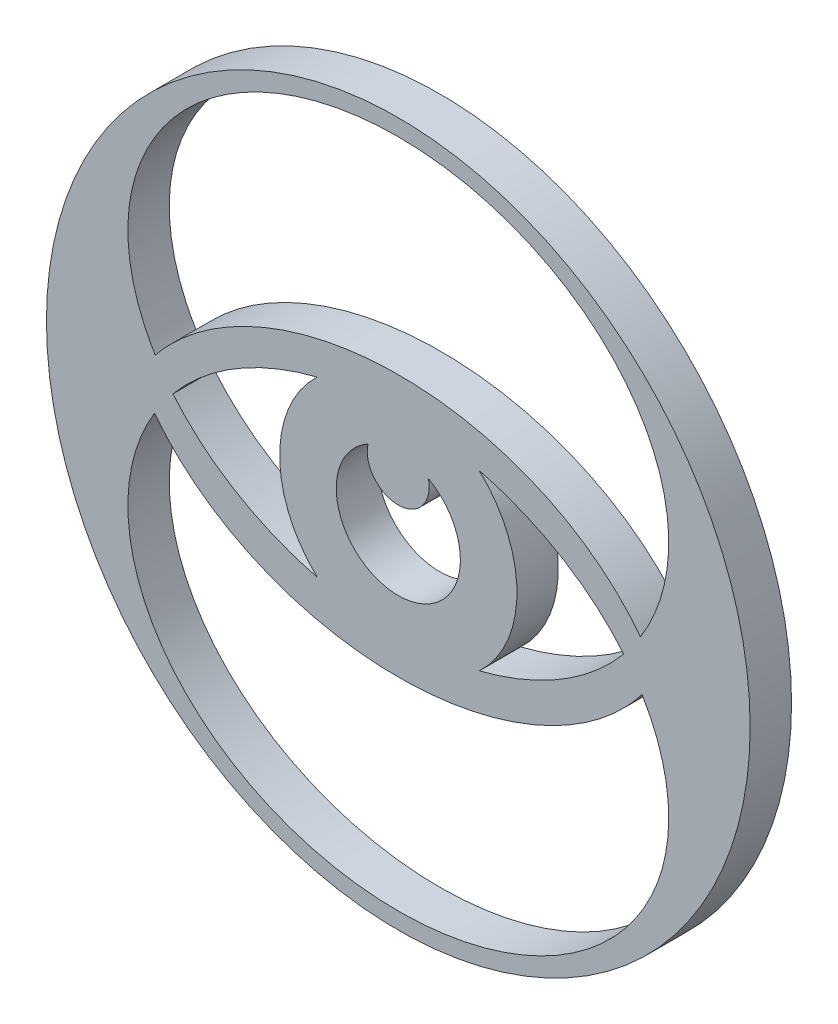
ISO-10303-21;
HEADER;
FILE_DESCRIPTION(('STEP AP214'),'2;1');
FILE_NAME('part.step','',(''),(''),'','','');
FILE_SCHEMA(('AUTOMOTIVE_DESIGN { 1 0 10303 214 1 1 1 1 }'));
ENDSEC;
DATA;
#1=APPLICATION_CONTEXT('core data for automotive mechanical design processes');
#2=APPLICATION_PROTOCOL_DEFINITION('international standard','automotive_design',2000,#1);
#3=PRODUCT_CONTEXT('',#1,'mechanical');
#4=PRODUCT('Part','Part','',(#3));
#5=PRODUCT_RELATED_PRODUCT_CATEGORY('part','',(#4));
#6=PRODUCT_DEFINITION_FORMATION('','',#4);
#7=PRODUCT_DEFINITION_CONTEXT('part definition',#1,'design');
#8=PRODUCT_DEFINITION('design','',#6,#7);
#9=PRODUCT_DEFINITION_SHAPE('','',#8);
#10=(LENGTH_UNIT() NAMED_UNIT(*) SI_UNIT(.MILLI.,.METRE.));
#11=(NAMED_UNIT(*) PLANE_ANGLE_UNIT() SI_UNIT($,.RADIAN.));
#12=(NAMED_UNIT(*) SI_UNIT($,.STERADIAN.) SOLID_ANGLE_UNIT());
#13=UNCERTAINTY_MEASURE_WITH_UNIT(LENGTH_MEASURE(1.E-05),#10,'distance_accuracy_value','');
#14=(GEOMETRIC_REPRESENTATION_CONTEXT(3) GLOBAL_UNCERTAINTY_ASSIGNED_CONTEXT((#13)) GLOBAL_UNIT_ASSIGNED_CONTEXT((#10,
#11,#12)) REPRESENTATION_CONTEXT('',''));
#15=CARTESIAN_POINT('',(0.,0.,0.));
#16=DIRECTION('',(0.,0.,1.));
#17=DIRECTION('',(1.,0.,0.));
#18=AXIS2_PLACEMENT_3D('',#15,#16,#17);
#19=CARTESIAN_POINT('',(0.,0.,30.));
#20=DIRECTION('',(0.,0.,-1.));
#21=DIRECTION('',(-1.,0.,0.));
#22=AXIS2_PLACEMENT_3D('',#19,#20,#21);
#23=CYLINDRICAL_SURFACE('',#22,45.);
#24=CARTESIAN_POINT('',(0.,0.,0.));
#25=DIRECTION('',(0.,0.,1.));
#26=DIRECTION('',(1.,0.,0.));
#27=AXIS2_PLACEMENT_3D('',#24,#25,#26);
#28=CIRCLE('',#27,45.);
#29=CARTESIAN_POINT('',(-21.946440501405,39.2855412247087,0.));
#30=VERTEX_POINT('',#29);
#31=CARTESIAN_POINT('',(21.7692025819729,39.3840299987828,0.));
#32=VERTEX_POINT('',#31);
#33=EDGE_CURVE('E172',#30,#32,#28,.T.);
#34=ORIENTED_EDGE('',*,*,#33,.F.);
#35=DIRECTION('',(0.,0.,-1.));
#36=VECTOR('',#35,1.);
#37=CARTESIAN_POINT('',(-21.946440501405,39.2855412247087,30.));
#38=LINE('',#37,#36);
#39=CARTESIAN_POINT('',(-21.946440501405,39.2855412247087,30.));
#40=VERTEX_POINT('',#39);
#41=EDGE_CURVE('E11',#40,#30,#38,.T.);
#42=ORIENTED_EDGE('',*,*,#41,.F.);
#43=CARTESIAN_POINT('',(0.,0.,30.));
#44=DIRECTION('',(0.,0.,1.));
#45=DIRECTION('',(1.,0.,0.));
#46=AXIS2_PLACEMENT_3D('',#43,#44,#45);
#47=CIRCLE('',#46,45.);
#48=CARTESIAN_POINT('',(21.7692025819729,39.3840299987828,30.));
#49=VERTEX_POINT('',#48);
#50=EDGE_CURVE('E235',#40,#49,#47,.T.);
#51=ORIENTED_EDGE('',*,*,#50,.T.);
#52=DIRECTION('',(0.,0.,-1.));
#53=VECTOR('',#52,1.);
#54=CARTESIAN_POINT('',(21.7692025819729,39.3840299987828,30.));
#55=LINE('',#54,#53);
#56=EDGE_CURVE('E47',#49,#32,#55,.T.);
#57=ORIENTED_EDGE('',*,*,#56,.T.);
#58=EDGE_LOOP('',(#34,#42,#51,#57));
#59=FACE_BOUND('',#58,.T.);
#60=ADVANCED_FACE('F37',(#59),#23,.F.);
#61=CARTESIAN_POINT('',(0.,-86.5,30.));
#62=DIRECTION('',(0.,0.,1.));
#63=DIRECTION('',(1.,0.,0.));
#64=AXIS2_PLACEMENT_3D('',#61,#62,#63);
#65=ELLIPSE('',#64,196.,156.5);
#66=DIRECTION('',(0.,0.,-1.));
#67=VECTOR('',#66,1.);
#68=SURFACE_OF_LINEAR_EXTRUSION('',#65,#67);
#69=CARTESIAN_POINT('',(0.,-86.5,0.));
#70=DIRECTION('',(0.,0.,1.));
#71=DIRECTION('',(1.,0.,0.));
#72=AXIS2_PLACEMENT_3D('',#69,#70,#71);
#73=ELLIPSE('',#72,196.,156.5);
#74=CARTESIAN_POINT('',(163.340502110404,0.,0.));
#75=VERTEX_POINT('',#74);
#76=CARTESIAN_POINT('',(58.7510553616709,62.8037697426945,0.));
#77=VERTEX_POINT('',#76);
#78=EDGE_CURVE('E209',#75,#77,#73,.T.);
#79=ORIENTED_EDGE('',*,*,#78,.F.);
#80=DIRECTION('',(0.,0.,-1.));
#81=VECTOR('',#80,1.);
#82=CARTESIAN_POINT('',(163.340502110404,0.,30.));
#83=LINE('',#82,#81);
#84=CARTESIAN_POINT('',(163.340502110404,0.,30.));
#85=VERTEX_POINT('',#84);
#86=EDGE_CURVE('E158',#85,#75,#83,.T.);
#87=ORIENTED_EDGE('',*,*,#86,.F.);
#88=CARTESIAN_POINT('',(58.7510553616709,62.8037697426945,30.));
#89=VERTEX_POINT('',#88);
#90=EDGE_CURVE('E140',#85,#89,#65,.T.);
#91=ORIENTED_EDGE('',*,*,#90,.T.);
#92=DIRECTION('',(0.,0.,-1.));
#93=VECTOR('',#92,1.);
#94=CARTESIAN_POINT('',(58.7510553616709,62.8037697426945,30.));
#95=LINE('',#94,#93);
#96=EDGE_CURVE('E147',#89,#77,#95,.T.);
#97=ORIENTED_EDGE('',*,*,#96,.T.);
#98=EDGE_LOOP('',(#79,#87,#91,#97));
#99=FACE_BOUND('',#98,.T.);
#100=ADVANCED_FACE('F157',(#99),#68,.T.);
#101=CARTESIAN_POINT('',(0.,86.5,30.));
#102=DIRECTION('',(0.,0.,1.));
#103=DIRECTION('',(-1.,0.,0.));
#104=AXIS2_PLACEMENT_3D('',#101,#102,#103);
#105=ELLIPSE('',#104,196.,156.5);
#106=DIRECTION('',(0.,0.,-1.));
#107=VECTOR('',#106,1.);
#108=SURFACE_OF_LINEAR_EXTRUSION('',#105,#107);
#109=CARTESIAN_POINT('',(0.,86.5,0.));
#110=DIRECTION('',(0.,0.,1.));
#111=DIRECTION('',(-1.,0.,0.));
#112=AXIS2_PLACEMENT_3D('',#109,#110,#111);
#113=ELLIPSE('',#112,196.,156.5);
#114=CARTESIAN_POINT('',(58.7510553616709,-62.8037697426945,0.));
#115=VERTEX_POINT('',#114);
#116=EDGE_CURVE('E211',#115,#75,#113,.T.);
#117=ORIENTED_EDGE('',*,*,#116,.F.);
#118=DIRECTION('',(0.,0.,-1.));
#119=VECTOR('',#118,1.);
#120=CARTESIAN_POINT('',(58.7510553616709,-62.8037697426945,30.));
#121=LINE('',#120,#119);
#122=CARTESIAN_POINT('',(58.7510553616709,-62.8037697426945,30.));
#123=VERTEX_POINT('',#122);
#124=EDGE_CURVE('E154',#123,#115,#121,.T.);
#125=ORIENTED_EDGE('',*,*,#124,.F.);
#126=EDGE_CURVE('E142',#123,#85,#105,.T.);
#127=ORIENTED_EDGE('',*,*,#126,.T.);
#128=ORIENTED_EDGE('',*,*,#86,.T.);
#129=EDGE_LOOP('',(#117,#125,#127,#128));
#130=FACE_BOUND('',#129,.T.);
#131=ADVANCED_FACE('F255',(#130),#108,.T.);
#132=CARTESIAN_POINT('',(0.,-86.5,30.));
#133=DIRECTION('',(0.,0.,1.));
#134=DIRECTION('',(1.,0.,0.));
#135=AXIS2_PLACEMENT_3D('',#132,#133,#134);
#136=ELLIPSE('',#135,196.,156.5);
#137=DIRECTION('',(0.,0.,-1.));
#138=VECTOR('',#137,1.);
#139=SURFACE_OF_LINEAR_EXTRUSION('',#136,#138);
#140=CARTESIAN_POINT('',(0.,-86.5,0.));
#141=DIRECTION('',(0.,0.,1.));
#142=DIRECTION('',(1.,0.,0.));
#143=AXIS2_PLACEMENT_3D('',#140,#141,#142);
#144=ELLIPSE('',#143,196.,156.5);
#145=CARTESIAN_POINT('',(-176.723140987711,-18.8185608645506,0.));
#146=VERTEX_POINT('',#145);
#147=CARTESIAN_POINT('',(176.655344592701,-18.7058146197285,0.));
#148=VERTEX_POINT('',#147);
#149=EDGE_CURVE('E217',#146,#148,#144,.T.);
#150=ORIENTED_EDGE('',*,*,#149,.F.);
#151=DIRECTION('',(0.,0.,-1.));
#152=VECTOR('',#151,1.);
#153=CARTESIAN_POINT('',(-176.723140987711,-18.8185608645506,30.));
#154=LINE('',#153,#152);
#155=CARTESIAN_POINT('',(-176.723140987711,-18.8185608645506,30.));
#156=VERTEX_POINT('',#155);
#157=EDGE_CURVE('E155',#156,#146,#154,.T.);
#158=ORIENTED_EDGE('',*,*,#157,.F.);
#159=CARTESIAN_POINT('',(176.655344592701,-18.7058146197285,30.));
#160=VERTEX_POINT('',#159);
#161=EDGE_CURVE('E164',#156,#160,#136,.T.);
#162=ORIENTED_EDGE('',*,*,#161,.T.);
#163=DIRECTION('',(0.,0.,-1.));
#164=VECTOR('',#163,1.);
#165=CARTESIAN_POINT('',(176.655344592701,-18.7058146197285,30.));
#166=LINE('',#165,#164);
#167=EDGE_CURVE('E182',#160,#148,#166,.T.);
#168=ORIENTED_EDGE('',*,*,#167,.T.);
#169=EDGE_LOOP('',(#150,#158,#162,#168));
#170=FACE_BOUND('',#169,.T.);
#171=ADVANCED_FACE('F251',(#170),#139,.T.);
#172=CARTESIAN_POINT('',(0.,86.5,30.));
#173=DIRECTION('',(0.,0.,1.));
#174=DIRECTION('',(-1.,0.,0.));
#175=AXIS2_PLACEMENT_3D('',#172,#173,#174);
#176=ELLIPSE('',#175,196.,156.5);
#177=DIRECTION('',(0.,0.,-1.));
#178=VECTOR('',#177,1.);
#179=SURFACE_OF_LINEAR_EXTRUSION('',#176,#178);
#180=CARTESIAN_POINT('',(0.,86.5,0.));
#181=DIRECTION('',(0.,0.,1.));
#182=DIRECTION('',(-1.,0.,0.));
#183=AXIS2_PLACEMENT_3D('',#180,#181,#182);
#184=ELLIPSE('',#183,196.,156.5);
#185=CARTESIAN_POINT('',(175.499994084895,16.8189527249847,0.));
#186=VERTEX_POINT('',#185);
#187=CARTESIAN_POINT('',(-176.156401014823,17.8830771517218,0.));
#188=VERTEX_POINT('',#187);
#189=EDGE_CURVE('E297',#186,#188,#184,.T.);
#190=ORIENTED_EDGE('',*,*,#189,.F.);
#191=DIRECTION('',(0.,0.,-1.));
#192=VECTOR('',#191,1.);
#193=CARTESIAN_POINT('',(175.499994084895,16.8189527249847,30.));
#194=LINE('',#193,#192);
#195=CARTESIAN_POINT('',(175.499994084895,16.8189527249847,30.));
#196=VERTEX_POINT('',#195);
#197=EDGE_CURVE('E184',#196,#186,#194,.T.);
#198=ORIENTED_EDGE('',*,*,#197,.F.);
#199=CARTESIAN_POINT('',(-176.156401014823,17.8830771517218,30.));
#200=VERTEX_POINT('',#199);
#201=EDGE_CURVE('E263',#196,#200,#176,.T.);
#202=ORIENTED_EDGE('',*,*,#201,.T.);
#203=DIRECTION('',(0.,0.,-1.));
#204=VECTOR('',#203,1.);
#205=CARTESIAN_POINT('',(-176.156401014823,17.8830771517218,30.));
#206=LINE('',#205,#204);
#207=EDGE_CURVE('E186',#200,#188,#206,.T.);
#208=ORIENTED_EDGE('',*,*,#207,.T.);
#209=EDGE_LOOP('',(#190,#198,#202,#208));
#210=FACE_BOUND('',#209,.T.);
#211=ADVANCED_FACE('F254',(#210),#179,.T.);
#212=CARTESIAN_POINT('',(-58.7510553616663,62.8037697426895,0.));
#213=VERTEX_POINT('',#212);
#214=CARTESIAN_POINT('',(-163.340502110404,0.,0.));
#215=VERTEX_POINT('',#214);
#216=EDGE_CURVE('E204',#213,#215,#73,.T.);
#217=ORIENTED_EDGE('',*,*,#216,.F.);
#218=DIRECTION('',(0.,0.,-1.));
#219=VECTOR('',#218,1.);
#220=CARTESIAN_POINT('',(-58.7510553616663,62.8037697426895,30.));
#221=LINE('',#220,#219);
#222=CARTESIAN_POINT('',(-58.7510553616663,62.8037697426895,30.));
#223=VERTEX_POINT('',#222);
#224=EDGE_CURVE('E41',#223,#213,#221,.T.);
#225=ORIENTED_EDGE('',*,*,#224,.F.);
#226=CARTESIAN_POINT('',(-163.340502110404,0.,30.));
#227=VERTEX_POINT('',#226);
#228=EDGE_CURVE('E161',#223,#227,#65,.T.);
#229=ORIENTED_EDGE('',*,*,#228,.T.);
#230=DIRECTION('',(0.,0.,-1.));
#231=VECTOR('',#230,1.);
#232=CARTESIAN_POINT('',(-163.340502110404,0.,30.));
#233=LINE('',#232,#231);
#234=EDGE_CURVE('E189',#227,#215,#233,.T.);
#235=ORIENTED_EDGE('',*,*,#234,.T.);
#236=EDGE_LOOP('',(#217,#225,#229,#235));
#237=FACE_BOUND('',#236,.T.);
#238=ADVANCED_FACE('F207',(#237),#68,.T.);
#239=CARTESIAN_POINT('',(0.,0.,30.));
#240=DIRECTION('',(0.,0.,-1.));
#241=DIRECTION('',(-1.,0.,0.));
#242=AXIS2_PLACEMENT_3D('',#239,#240,#241);
#243=CYLINDRICAL_SURFACE('',#242,86.0000000000136);
#244=CARTESIAN_POINT('',(0.,0.,0.));
#245=DIRECTION('',(0.,0.,1.));
#246=DIRECTION('',(1.,0.,0.));
#247=AXIS2_PLACEMENT_3D('',#244,#245,#246);
#248=CIRCLE('',#247,86.0000000000136);
#249=CARTESIAN_POINT('',(-58.7510553616483,-62.8037697427063,0.));
#250=VERTEX_POINT('',#249);
#251=EDGE_CURVE('E198',#213,#250,#248,.T.);
#252=ORIENTED_EDGE('',*,*,#251,.T.);
#253=DIRECTION('',(0.,0.,-1.));
#254=VECTOR('',#253,1.);
#255=CARTESIAN_POINT('',(-58.7510553616483,-62.8037697427063,30.));
#256=LINE('',#255,#254);
#257=CARTESIAN_POINT('',(-58.7510553616483,-62.8037697427063,30.));
#258=VERTEX_POINT('',#257);
#259=EDGE_CURVE('E190',#258,#250,#256,.T.);
#260=ORIENTED_EDGE('',*,*,#259,.F.);
#261=CARTESIAN_POINT('',(0.,0.,30.));
#262=DIRECTION('',(0.,0.,1.));
#263=DIRECTION('',(1.,0.,0.));
#264=AXIS2_PLACEMENT_3D('',#261,#262,#263);
#265=CIRCLE('',#264,86.0000000000136);
#266=EDGE_CURVE('E168',#223,#258,#265,.T.);
#267=ORIENTED_EDGE('',*,*,#266,.F.);
#268=ORIENTED_EDGE('',*,*,#224,.T.);
#269=EDGE_LOOP('',(#252,#260,#267,#268));
#270=FACE_BOUND('',#269,.T.);
#271=ADVANCED_FACE('F39',(#270),#243,.T.);
#272=CARTESIAN_POINT('',(0.,0.,30.));
#273=DIRECTION('',(0.,0.,-1.));
#274=DIRECTION('',(-1.,0.,0.));
#275=AXIS2_PLACEMENT_3D('',#272,#273,#274);
#276=CYLINDRICAL_SURFACE('',#275,255.007073506147);
#277=CARTESIAN_POINT('',(0.,0.,30.));
#278=DIRECTION('',(0.,0.,1.));
#279=DIRECTION('',(1.,0.,0.));
#280=AXIS2_PLACEMENT_3D('',#277,#278,#279);
#281=CIRCLE('',#280,255.007073506147);
#282=CARTESIAN_POINT('',(255.007073506147,0.,30.));
#283=VERTEX_POINT('',#282);
#284=EDGE_CURVE('E144',#283,#283,#281,.T.);
#285=ORIENTED_EDGE('',*,*,#284,.F.);
#286=EDGE_LOOP('',(#285));
#287=FACE_BOUND('',#286,.T.);
#288=CARTESIAN_POINT('',(0.,0.,0.));
#289=DIRECTION('',(0.,0.,1.));
#290=DIRECTION('',(1.,0.,0.));
#291=AXIS2_PLACEMENT_3D('',#288,#289,#290);
#292=CIRCLE('',#291,255.007073506147);
#293=CARTESIAN_POINT('',(255.007073506147,0.,0.));
#294=VERTEX_POINT('',#293);
#295=EDGE_CURVE('E175',#294,#294,#292,.T.);
#296=ORIENTED_EDGE('',*,*,#295,.T.);
#297=EDGE_LOOP('',(#296));
#298=FACE_BOUND('',#297,.T.);
#299=ADVANCED_FACE('F230',(#287,#298),#276,.T.);
#300=CARTESIAN_POINT('',(0.,0.,30.));
#301=DIRECTION('',(0.,0.,-1.));
#302=DIRECTION('',(-1.,0.,0.));
#303=AXIS2_PLACEMENT_3D('',#300,#301,#302);
#304=CYLINDRICAL_SURFACE('',#303,86.0000000000204);
#305=CARTESIAN_POINT('',(0.,0.,0.));
#306=DIRECTION('',(0.,0.,1.));
#307=DIRECTION('',(1.,0.,0.));
#308=AXIS2_PLACEMENT_3D('',#305,#306,#307);
#309=CIRCLE('',#308,86.0000000000204);
#310=EDGE_CURVE('E150',#115,#77,#309,.T.);
#311=ORIENTED_EDGE('',*,*,#310,.T.);
#312=ORIENTED_EDGE('',*,*,#96,.F.);
#313=CARTESIAN_POINT('',(0.,0.,30.));
#314=DIRECTION('',(0.,0.,1.));
#315=DIRECTION('',(1.,0.,0.));
#316=AXIS2_PLACEMENT_3D('',#313,#314,#315);
#317=CIRCLE('',#316,86.0000000000204);
#318=EDGE_CURVE('E135',#123,#89,#317,.T.);
#319=ORIENTED_EDGE('',*,*,#318,.F.);
#320=ORIENTED_EDGE('',*,*,#124,.T.);
#321=EDGE_LOOP('',(#311,#312,#319,#320));
#322=FACE_BOUND('',#321,.T.);
#323=ADVANCED_FACE('F148',(#322),#304,.T.);
#324=CARTESIAN_POINT('',(-0.0772040652927963,60.8494114035181,30.));
#325=DIRECTION('',(0.,0.,1.));
#326=DIRECTION('',(1.,0.,0.));
#327=AXIS2_PLACEMENT_3D('',#324,#325,#326);
#328=ELLIPSE('',#327,205.,157.);
#329=DIRECTION('',(0.,0.,-1.));
#330=VECTOR('',#329,1.);
#331=SURFACE_OF_LINEAR_EXTRUSION('',#328,#330);
#332=CARTESIAN_POINT('',(-0.0772040652927963,60.8494114035181,0.));
#333=DIRECTION('',(0.,0.,1.));
#334=DIRECTION('',(1.,0.,0.));
#335=AXIS2_PLACEMENT_3D('',#332,#333,#334);
#336=ELLIPSE('',#335,205.,157.);
#337=EDGE_CURVE('E212',#146,#148,#336,.T.);
#338=ORIENTED_EDGE('',*,*,#337,.T.);
#339=ORIENTED_EDGE('',*,*,#167,.F.);
#340=EDGE_CURVE('E159',#156,#160,#328,.T.);
#341=ORIENTED_EDGE('',*,*,#340,.F.);
#342=ORIENTED_EDGE('',*,*,#157,.T.);
#343=EDGE_LOOP('',(#338,#339,#341,#342));
#344=FACE_BOUND('',#343,.T.);
#345=ADVANCED_FACE('F245',(#344),#331,.F.);
#346=CARTESIAN_POINT('',(-2.49063542461042,-63.3058048667943,30.));
#347=DIRECTION('',(0.,0.,1.));
#348=DIRECTION('',(0.999526837390588,0.0307587603126333,0.));
#349=AXIS2_PLACEMENT_3D('',#346,#347,#348);
#350=ELLIPSE('',#349,205.,157.);
#351=DIRECTION('',(0.,0.,-1.));
#352=VECTOR('',#351,1.);
#353=SURFACE_OF_LINEAR_EXTRUSION('',#350,#352);
#354=CARTESIAN_POINT('',(-2.49063542461042,-63.3058048667943,0.));
#355=DIRECTION('',(0.,0.,1.));
#356=DIRECTION('',(0.999526837390588,0.0307587603126333,0.));
#357=AXIS2_PLACEMENT_3D('',#354,#355,#356);
#358=ELLIPSE('',#357,205.,157.);
#359=EDGE_CURVE('E223',#186,#188,#358,.T.);
#360=ORIENTED_EDGE('',*,*,#359,.T.);
#361=ORIENTED_EDGE('',*,*,#207,.F.);
#362=EDGE_CURVE('E261',#196,#200,#350,.T.);
#363=ORIENTED_EDGE('',*,*,#362,.F.);
#364=ORIENTED_EDGE('',*,*,#197,.T.);
#365=EDGE_LOOP('',(#360,#361,#363,#364));
#366=FACE_BOUND('',#365,.T.);
#367=ADVANCED_FACE('F249',(#366),#353,.F.);
#368=EDGE_CURVE('E205',#215,#250,#113,.T.);
#369=ORIENTED_EDGE('',*,*,#368,.F.);
#370=ORIENTED_EDGE('',*,*,#234,.F.);
#371=EDGE_CURVE('E163',#227,#258,#105,.T.);
#372=ORIENTED_EDGE('',*,*,#371,.T.);
#373=ORIENTED_EDGE('',*,*,#259,.T.);
#374=EDGE_LOOP('',(#369,#370,#372,#373));
#375=FACE_BOUND('',#374,.T.);
#376=ADVANCED_FACE('F258',(#375),#108,.T.);
#377=CARTESIAN_POINT('',(-0.0772040652927963,34.2681223789737,30.));
#378=DIRECTION('',(0.,0.,-1.));
#379=DIRECTION('',(-1.,0.,0.));
#380=AXIS2_PLACEMENT_3D('',#377,#378,#379);
#381=CYLINDRICAL_SURFACE('',#380,22.4374239647094);
#382=CARTESIAN_POINT('',(-0.0772040652927963,34.2681223789737,0.));
#383=DIRECTION('',(0.,0.,1.));
#384=DIRECTION('',(1.,0.,0.));
#385=AXIS2_PLACEMENT_3D('',#382,#383,#384);
#386=CIRCLE('',#385,22.4374239647094);
#387=EDGE_CURVE('E169',#30,#32,#386,.T.);
#388=ORIENTED_EDGE('',*,*,#387,.T.);
#389=ORIENTED_EDGE('',*,*,#56,.F.);
#390=CARTESIAN_POINT('',(-0.0772040652927963,34.2681223789737,30.));
#391=DIRECTION('',(0.,0.,1.));
#392=DIRECTION('',(1.,0.,0.));
#393=AXIS2_PLACEMENT_3D('',#390,#391,#392);
#394=CIRCLE('',#393,22.4374239647094);
#395=EDGE_CURVE('E55',#40,#49,#394,.T.);
#396=ORIENTED_EDGE('',*,*,#395,.F.);
#397=ORIENTED_EDGE('',*,*,#41,.T.);
#398=EDGE_LOOP('',(#388,#389,#396,#397));
#399=FACE_BOUND('',#398,.T.);
#400=ADVANCED_FACE('F236',(#399),#381,.T.);
#401=CARTESIAN_POINT('',(0.,0.,30.));
#402=DIRECTION('',(0.,0.,1.));
#403=DIRECTION('',(1.,0.,0.));
#404=AXIS2_PLACEMENT_3D('',#401,#402,#403);
#405=PLANE('',#404);
#406=ORIENTED_EDGE('',*,*,#228,.F.);
#407=ORIENTED_EDGE('',*,*,#266,.T.);
#408=ORIENTED_EDGE('',*,*,#371,.F.);
#409=EDGE_LOOP('',(#406,#407,#408));
#410=FACE_BOUND('',#409,.T.);
#411=ORIENTED_EDGE('',*,*,#201,.F.);
#412=ORIENTED_EDGE('',*,*,#362,.T.);
#413=EDGE_LOOP('',(#411,#412));
#414=FACE_BOUND('',#413,.T.);
#415=ORIENTED_EDGE('',*,*,#161,.F.);
#416=ORIENTED_EDGE('',*,*,#340,.T.);
#417=EDGE_LOOP('',(#415,#416));
#418=FACE_BOUND('',#417,.T.);
#419=ORIENTED_EDGE('',*,*,#90,.F.);
#420=ORIENTED_EDGE('',*,*,#126,.F.);
#421=ORIENTED_EDGE('',*,*,#318,.T.);
#422=EDGE_LOOP('',(#419,#420,#421));
#423=FACE_BOUND('',#422,.T.);
#424=ORIENTED_EDGE('',*,*,#284,.T.);
#425=EDGE_LOOP('',(#424));
#426=FACE_BOUND('',#425,.T.);
#427=ORIENTED_EDGE('',*,*,#50,.F.);
#428=ORIENTED_EDGE('',*,*,#395,.T.);
#429=EDGE_LOOP('',(#427,#428));
#430=FACE_BOUND('',#429,.T.);
#431=ADVANCED_FACE('F137',(#410,#414,#418,#423,#426,#430),#405,.T.);
#432=CARTESIAN_POINT('',(0.,0.,0.));
#433=DIRECTION('',(0.,0.,1.));
#434=DIRECTION('',(1.,0.,0.));
#435=AXIS2_PLACEMENT_3D('',#432,#433,#434);
#436=PLANE('',#435);
#437=ORIENTED_EDGE('',*,*,#216,.T.);
#438=ORIENTED_EDGE('',*,*,#368,.T.);
#439=ORIENTED_EDGE('',*,*,#251,.F.);
#440=EDGE_LOOP('',(#437,#438,#439));
#441=FACE_BOUND('',#440,.T.);
#442=ORIENTED_EDGE('',*,*,#189,.T.);
#443=ORIENTED_EDGE('',*,*,#359,.F.);
#444=EDGE_LOOP('',(#442,#443));
#445=FACE_BOUND('',#444,.T.);
#446=ORIENTED_EDGE('',*,*,#149,.T.);
#447=ORIENTED_EDGE('',*,*,#337,.F.);
#448=EDGE_LOOP('',(#446,#447));
#449=FACE_BOUND('',#448,.T.);
#450=ORIENTED_EDGE('',*,*,#78,.T.);
#451=ORIENTED_EDGE('',*,*,#310,.F.);
#452=ORIENTED_EDGE('',*,*,#116,.T.);
#453=EDGE_LOOP('',(#450,#451,#452));
#454=FACE_BOUND('',#453,.T.);
#455=ORIENTED_EDGE('',*,*,#295,.F.);
#456=EDGE_LOOP('',(#455));
#457=FACE_BOUND('',#456,.T.);
#458=ORIENTED_EDGE('',*,*,#33,.T.);
#459=ORIENTED_EDGE('',*,*,#387,.F.);
#460=EDGE_LOOP('',(#458,#459));
#461=FACE_BOUND('',#460,.T.);
#462=ADVANCED_FACE('F202',(#441,#445,#449,#454,#457,#461),#436,.F.);
#463=CLOSED_SHELL('',(#60,#100,#131,#171,#211,#238,#271,#299,#323,#345,#367,#376,#400,#431,#462));
#464=MANIFOLD_SOLID_BREP('B2',#463);
#465=ADVANCED_BREP_SHAPE_REPRESENTATION('',(#18,#464),#14);
#466=SHAPE_DEFINITION_REPRESENTATION(#9,#465);
ENDSEC;
END-ISO-10303-21;
